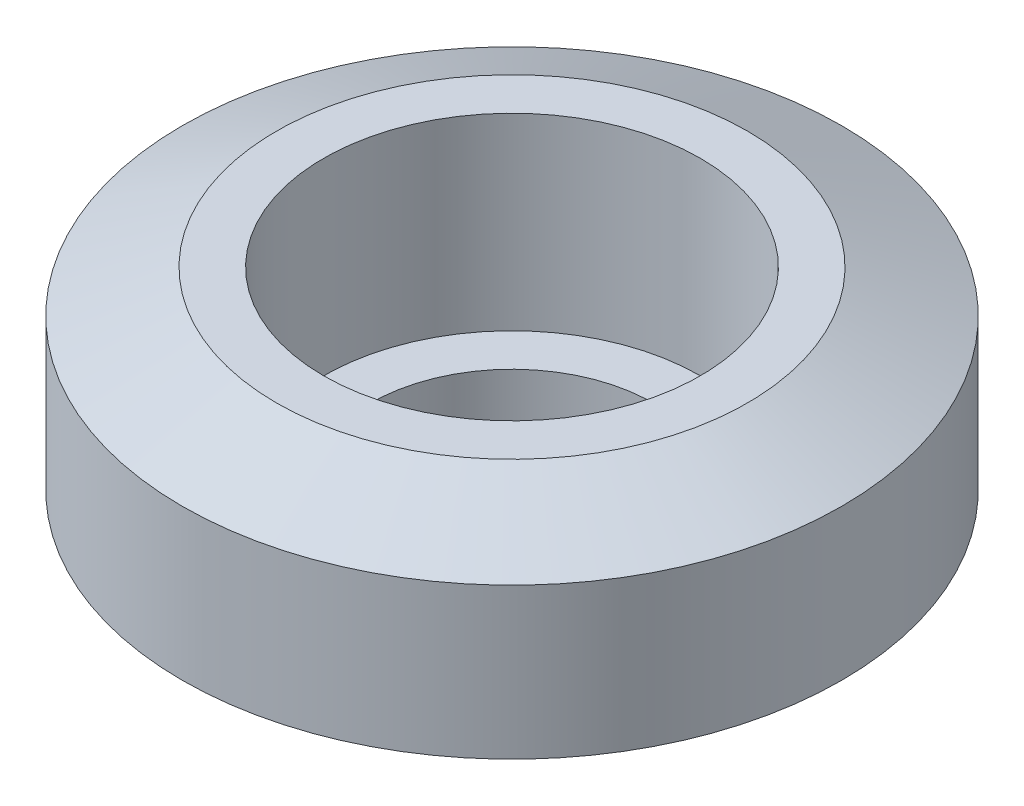
ISO-10303-21;
HEADER;
FILE_DESCRIPTION(('STEP AP214'),'2;1');
FILE_NAME('part.step','',(''),(''),'','','');
FILE_SCHEMA(('AUTOMOTIVE_DESIGN { 1 0 10303 214 1 1 1 1 }'));
ENDSEC;
DATA;
#1=APPLICATION_CONTEXT('core data for automotive mechanical design processes');
#2=APPLICATION_PROTOCOL_DEFINITION('international standard','automotive_design',2000,#1);
#3=PRODUCT_CONTEXT('',#1,'mechanical');
#4=PRODUCT('Part','Part','',(#3));
#5=PRODUCT_RELATED_PRODUCT_CATEGORY('part','',(#4));
#6=PRODUCT_DEFINITION_FORMATION('','',#4);
#7=PRODUCT_DEFINITION_CONTEXT('part definition',#1,'design');
#8=PRODUCT_DEFINITION('design','',#6,#7);
#9=PRODUCT_DEFINITION_SHAPE('','',#8);
#10=(LENGTH_UNIT() NAMED_UNIT(*) SI_UNIT(.MILLI.,.METRE.));
#11=(NAMED_UNIT(*) PLANE_ANGLE_UNIT() SI_UNIT($,.RADIAN.));
#12=(NAMED_UNIT(*) SI_UNIT($,.STERADIAN.) SOLID_ANGLE_UNIT());
#13=UNCERTAINTY_MEASURE_WITH_UNIT(LENGTH_MEASURE(1.E-05),#10,'distance_accuracy_value','');
#14=(GEOMETRIC_REPRESENTATION_CONTEXT(3) GLOBAL_UNCERTAINTY_ASSIGNED_CONTEXT((#13)) GLOBAL_UNIT_ASSIGNED_CONTEXT((#10,
#11,#12)) REPRESENTATION_CONTEXT('',''));
#15=CARTESIAN_POINT('',(0.,0.,0.));
#16=DIRECTION('',(0.,0.,1.));
#17=DIRECTION('',(1.,0.,0.));
#18=AXIS2_PLACEMENT_3D('',#15,#16,#17);
#19=CARTESIAN_POINT('',(0.,5.,0.));
#20=DIRECTION('',(0.,1.,0.));
#21=DIRECTION('',(0.,0.,1.));
#22=AXIS2_PLACEMENT_3D('',#19,#20,#21);
#23=PLANE('',#22);
#24=CARTESIAN_POINT('',(0.,5.,0.));
#25=DIRECTION('',(0.,1.,0.));
#26=DIRECTION('',(0.,0.,1.));
#27=AXIS2_PLACEMENT_3D('',#24,#25,#26);
#28=CIRCLE('',#27,8.);
#29=CARTESIAN_POINT('',(0.,5.,8.));
#30=VERTEX_POINT('',#29);
#31=EDGE_CURVE('E52',#30,#30,#28,.T.);
#32=ORIENTED_EDGE('',*,*,#31,.F.);
#33=EDGE_LOOP('',(#32));
#34=FACE_BOUND('',#33,.T.);
#35=CARTESIAN_POINT('',(0.,5.,0.));
#36=DIRECTION('',(0.,-1.,0.));
#37=DIRECTION('',(0.,0.,-1.));
#38=AXIS2_PLACEMENT_3D('',#35,#36,#37);
#39=CIRCLE('',#38,10.);
#40=CARTESIAN_POINT('',(0.,5.,-10.));
#41=VERTEX_POINT('',#40);
#42=EDGE_CURVE('E10',#41,#41,#39,.T.);
#43=ORIENTED_EDGE('',*,*,#42,.F.);
#44=EDGE_LOOP('',(#43));
#45=FACE_BOUND('',#44,.T.);
#46=ADVANCED_FACE('F32',(#34,#45),#23,.T.);
#47=CARTESIAN_POINT('',(0.,3.2,0.));
#48=DIRECTION('',(0.,-1.,0.));
#49=DIRECTION('',(0.,0.,-1.));
#50=AXIS2_PLACEMENT_3D('',#47,#48,#49);
#51=CONICAL_SURFACE('',#50,14.,1.14794240066196);
#52=ORIENTED_EDGE('',*,*,#42,.T.);
#53=EDGE_LOOP('',(#52));
#54=FACE_BOUND('',#53,.T.);
#55=CARTESIAN_POINT('',(0.,3.2,0.));
#56=DIRECTION('',(0.,-1.,0.));
#57=DIRECTION('',(0.,0.,-1.));
#58=AXIS2_PLACEMENT_3D('',#55,#56,#57);
#59=CIRCLE('',#58,14.);
#60=CARTESIAN_POINT('',(0.,3.2,-14.));
#61=VERTEX_POINT('',#60);
#62=EDGE_CURVE('E39',#61,#61,#59,.T.);
#63=ORIENTED_EDGE('',*,*,#62,.F.);
#64=EDGE_LOOP('',(#63));
#65=FACE_BOUND('',#64,.T.);
#66=ADVANCED_FACE('F82',(#54,#65),#51,.T.);
#67=CARTESIAN_POINT('',(0.,-5.,0.));
#68=DIRECTION('',(0.,-1.,0.));
#69=DIRECTION('',(0.,0.,-1.));
#70=AXIS2_PLACEMENT_3D('',#67,#68,#69);
#71=CYLINDRICAL_SURFACE('',#70,14.);
#72=ORIENTED_EDGE('',*,*,#62,.T.);
#73=EDGE_LOOP('',(#72));
#74=FACE_BOUND('',#73,.T.);
#75=CARTESIAN_POINT('',(0.,-3.2,0.));
#76=DIRECTION('',(0.,-1.,0.));
#77=DIRECTION('',(0.,0.,-1.));
#78=AXIS2_PLACEMENT_3D('',#75,#76,#77);
#79=CIRCLE('',#78,14.);
#80=CARTESIAN_POINT('',(0.,-3.2,-14.));
#81=VERTEX_POINT('',#80);
#82=EDGE_CURVE('E43',#81,#81,#79,.T.);
#83=ORIENTED_EDGE('',*,*,#82,.F.);
#84=EDGE_LOOP('',(#83));
#85=FACE_BOUND('',#84,.T.);
#86=ADVANCED_FACE('F86',(#74,#85),#71,.T.);
#87=CARTESIAN_POINT('',(0.,-5.,0.));
#88=DIRECTION('',(0.,1.,0.));
#89=DIRECTION('',(0.,0.,1.));
#90=AXIS2_PLACEMENT_3D('',#87,#88,#89);
#91=CONICAL_SURFACE('',#90,10.,1.14794240066196);
#92=ORIENTED_EDGE('',*,*,#82,.T.);
#93=EDGE_LOOP('',(#92));
#94=FACE_BOUND('',#93,.T.);
#95=CARTESIAN_POINT('',(0.,-5.,0.));
#96=DIRECTION('',(0.,-1.,0.));
#97=DIRECTION('',(0.,0.,-1.));
#98=AXIS2_PLACEMENT_3D('',#95,#96,#97);
#99=CIRCLE('',#98,10.);
#100=CARTESIAN_POINT('',(0.,-5.,-10.));
#101=VERTEX_POINT('',#100);
#102=EDGE_CURVE('E48',#101,#101,#99,.T.);
#103=ORIENTED_EDGE('',*,*,#102,.F.);
#104=EDGE_LOOP('',(#103));
#105=FACE_BOUND('',#104,.T.);
#106=ADVANCED_FACE('F90',(#94,#105),#91,.T.);
#107=CARTESIAN_POINT('',(10.,-5.,0.));
#108=DIRECTION('',(0.,-1.,0.));
#109=DIRECTION('',(0.,0.,-1.));
#110=AXIS2_PLACEMENT_3D('',#107,#108,#109);
#111=PLANE('',#110);
#112=CARTESIAN_POINT('',(0.,-5.,0.));
#113=DIRECTION('',(0.,1.,0.));
#114=DIRECTION('',(0.,0.,1.));
#115=AXIS2_PLACEMENT_3D('',#112,#113,#114);
#116=CIRCLE('',#115,6.);
#117=CARTESIAN_POINT('',(0.,-5.,6.));
#118=VERTEX_POINT('',#117);
#119=EDGE_CURVE('E57',#118,#118,#116,.T.);
#120=ORIENTED_EDGE('',*,*,#119,.T.);
#121=EDGE_LOOP('',(#120));
#122=FACE_BOUND('',#121,.T.);
#123=ORIENTED_EDGE('',*,*,#102,.T.);
#124=EDGE_LOOP('',(#123));
#125=FACE_BOUND('',#124,.T.);
#126=ADVANCED_FACE('F76',(#122,#125),#111,.T.);
#127=CARTESIAN_POINT('',(0.,-3.,0.));
#128=DIRECTION('',(0.,1.,0.));
#129=DIRECTION('',(0.,0.,1.));
#130=AXIS2_PLACEMENT_3D('',#127,#128,#129);
#131=CYLINDRICAL_SURFACE('',#130,8.);
#132=CARTESIAN_POINT('',(0.,-3.,0.));
#133=DIRECTION('',(0.,1.,0.));
#134=DIRECTION('',(0.,0.,1.));
#135=AXIS2_PLACEMENT_3D('',#132,#133,#134);
#136=CIRCLE('',#135,8.);
#137=CARTESIAN_POINT('',(0.,-3.,8.));
#138=VERTEX_POINT('',#137);
#139=EDGE_CURVE('E51',#138,#138,#136,.T.);
#140=ORIENTED_EDGE('',*,*,#139,.F.);
#141=EDGE_LOOP('',(#140));
#142=FACE_BOUND('',#141,.T.);
#143=ORIENTED_EDGE('',*,*,#31,.T.);
#144=EDGE_LOOP('',(#143));
#145=FACE_BOUND('',#144,.T.);
#146=ADVANCED_FACE('F70',(#142,#145),#131,.F.);
#147=CARTESIAN_POINT('',(0.,-3.,0.));
#148=DIRECTION('',(0.,1.,0.));
#149=DIRECTION('',(0.,0.,1.));
#150=AXIS2_PLACEMENT_3D('',#147,#148,#149);
#151=PLANE('',#150);
#152=CARTESIAN_POINT('',(0.,-3.,0.));
#153=DIRECTION('',(0.,1.,0.));
#154=DIRECTION('',(0.,0.,1.));
#155=AXIS2_PLACEMENT_3D('',#152,#153,#154);
#156=CIRCLE('',#155,6.);
#157=CARTESIAN_POINT('',(0.,-3.,6.));
#158=VERTEX_POINT('',#157);
#159=EDGE_CURVE('E35',#158,#158,#156,.T.);
#160=ORIENTED_EDGE('',*,*,#159,.F.);
#161=EDGE_LOOP('',(#160));
#162=FACE_BOUND('',#161,.T.);
#163=ORIENTED_EDGE('',*,*,#139,.T.);
#164=EDGE_LOOP('',(#163));
#165=FACE_BOUND('',#164,.T.);
#166=ADVANCED_FACE('F67',(#162,#165),#151,.T.);
#167=CARTESIAN_POINT('',(0.,-5.,0.));
#168=DIRECTION('',(0.,1.,0.));
#169=DIRECTION('',(0.,0.,1.));
#170=AXIS2_PLACEMENT_3D('',#167,#168,#169);
#171=CYLINDRICAL_SURFACE('',#170,6.);
#172=ORIENTED_EDGE('',*,*,#159,.T.);
#173=EDGE_LOOP('',(#172));
#174=FACE_BOUND('',#173,.T.);
#175=ORIENTED_EDGE('',*,*,#119,.F.);
#176=EDGE_LOOP('',(#175));
#177=FACE_BOUND('',#176,.T.);
#178=ADVANCED_FACE('F64',(#174,#177),#171,.F.);
#179=CLOSED_SHELL('',(#46,#66,#86,#106,#126,#146,#166,#178));
#180=MANIFOLD_SOLID_BREP('B2',#179);
#181=ADVANCED_BREP_SHAPE_REPRESENTATION('',(#18,#180),#14);
#182=SHAPE_DEFINITION_REPRESENTATION(#9,#181);
ENDSEC;
END-ISO-10303-21;
